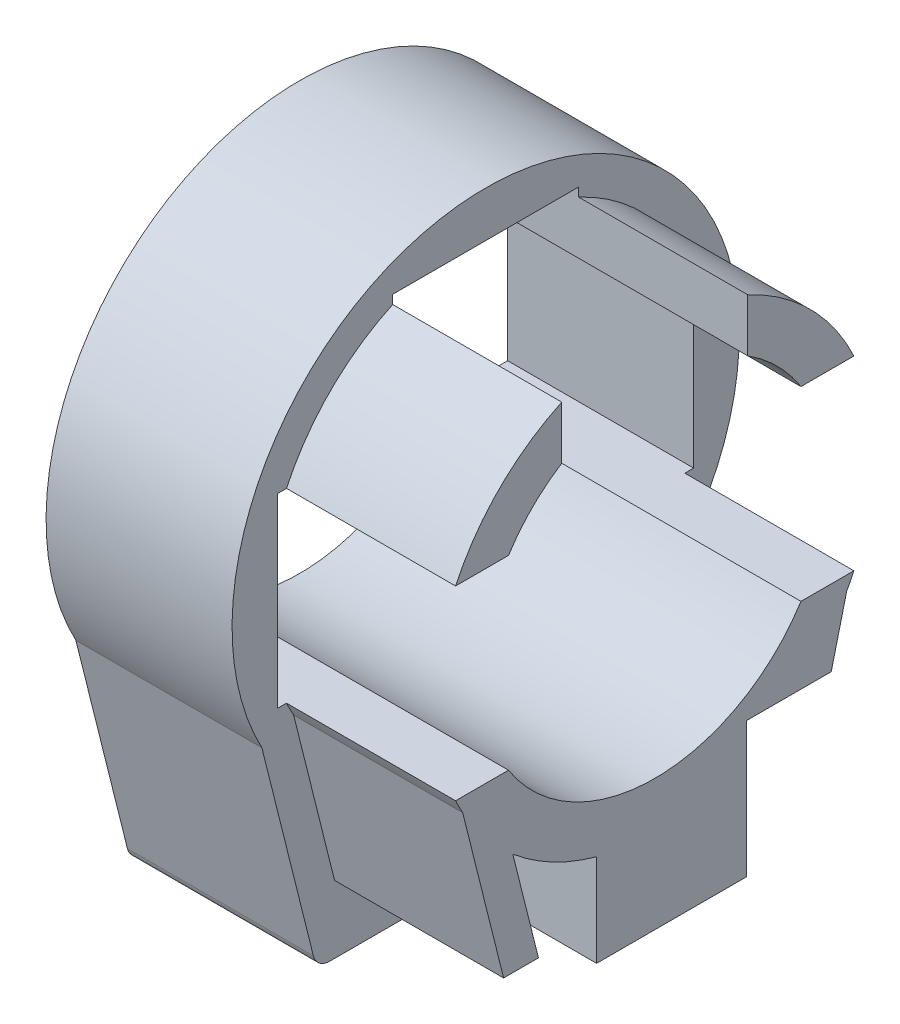
ISO-10303-21;
HEADER;
FILE_DESCRIPTION(('STEP AP214'),'2;1');
FILE_NAME('part.step','',(''),(''),'','','');
FILE_SCHEMA(('AUTOMOTIVE_DESIGN { 1 0 10303 214 1 1 1 1 }'));
ENDSEC;
DATA;
#1=APPLICATION_CONTEXT('core data for automotive mechanical design processes');
#2=APPLICATION_PROTOCOL_DEFINITION('international standard','automotive_design',2000,#1);
#3=PRODUCT_CONTEXT('',#1,'mechanical');
#4=PRODUCT('Part','Part','',(#3));
#5=PRODUCT_RELATED_PRODUCT_CATEGORY('part','',(#4));
#6=PRODUCT_DEFINITION_FORMATION('','',#4);
#7=PRODUCT_DEFINITION_CONTEXT('part definition',#1,'design');
#8=PRODUCT_DEFINITION('design','',#6,#7);
#9=PRODUCT_DEFINITION_SHAPE('','',#8);
#10=(LENGTH_UNIT() NAMED_UNIT(*) SI_UNIT(.MILLI.,.METRE.));
#11=(NAMED_UNIT(*) PLANE_ANGLE_UNIT() SI_UNIT($,.RADIAN.));
#12=(NAMED_UNIT(*) SI_UNIT($,.STERADIAN.) SOLID_ANGLE_UNIT());
#13=UNCERTAINTY_MEASURE_WITH_UNIT(LENGTH_MEASURE(1.E-05),#10,'distance_accuracy_value','');
#14=(GEOMETRIC_REPRESENTATION_CONTEXT(3) GLOBAL_UNCERTAINTY_ASSIGNED_CONTEXT((#13)) GLOBAL_UNIT_ASSIGNED_CONTEXT((#10,
#11,#12)) REPRESENTATION_CONTEXT('',''));
#15=CARTESIAN_POINT('',(0.,0.,0.));
#16=DIRECTION('',(0.,0.,1.));
#17=DIRECTION('',(1.,0.,0.));
#18=AXIS2_PLACEMENT_3D('',#15,#16,#17);
#19=CARTESIAN_POINT('',(21.001,0.,2.69999999999999));
#20=DIRECTION('',(0.,0.,1.));
#21=DIRECTION('',(1.,0.,0.));
#22=AXIS2_PLACEMENT_3D('',#19,#20,#21);
#23=PLANE('',#22);
#24=DIRECTION('',(-1.,0.,0.));
#25=VECTOR('',#24,1.);
#26=CARTESIAN_POINT('',(21.001,14.5,2.69999999999999));
#27=LINE('',#26,#25);
#28=CARTESIAN_POINT('',(11.,14.5,2.69999999999999));
#29=VERTEX_POINT('',#28);
#30=CARTESIAN_POINT('',(0.,14.5,2.69999999999999));
#31=VERTEX_POINT('',#30);
#32=EDGE_CURVE('E370',#29,#31,#27,.T.);
#33=ORIENTED_EDGE('',*,*,#32,.F.);
#34=DIRECTION('',(0.,-1.,0.));
#35=VECTOR('',#34,1.);
#36=CARTESIAN_POINT('',(11.,0.,2.69999999999999));
#37=LINE('',#36,#35);
#38=CARTESIAN_POINT('',(11.,25.5,2.69999999999999));
#39=VERTEX_POINT('',#38);
#40=EDGE_CURVE('E429',#39,#29,#37,.T.);
#41=ORIENTED_EDGE('',*,*,#40,.F.);
#42=DIRECTION('',(-1.,0.,0.));
#43=VECTOR('',#42,1.);
#44=CARTESIAN_POINT('',(21.001,25.5,2.69999999999999));
#45=LINE('',#44,#43);
#46=CARTESIAN_POINT('',(0.,25.5,2.69999999999999));
#47=VERTEX_POINT('',#46);
#48=EDGE_CURVE('E391',#39,#47,#45,.T.);
#49=ORIENTED_EDGE('',*,*,#48,.T.);
#50=DIRECTION('',(0.,1.,0.));
#51=VECTOR('',#50,1.);
#52=CARTESIAN_POINT('',(0.,0.,2.69999999999999));
#53=LINE('',#52,#51);
#54=EDGE_CURVE('E373',#31,#47,#53,.T.);
#55=ORIENTED_EDGE('',*,*,#54,.F.);
#56=EDGE_LOOP('',(#33,#41,#49,#55));
#57=FACE_BOUND('',#56,.T.);
#58=ADVANCED_FACE('F36',(#57),#23,.T.);
#59=CARTESIAN_POINT('',(21.001,32.3000000000002,3.26001851776298E-13));
#60=DIRECTION('',(0.,-1.,0.));
#61=DIRECTION('',(0.,0.,-1.));
#62=AXIS2_PLACEMENT_3D('',#59,#60,#61);
#63=PLANE('',#62);
#64=DIRECTION('',(-1.,0.,0.));
#65=VECTOR('',#64,1.);
#66=CARTESIAN_POINT('',(21.001,32.3000000000001,9.50000000000012));
#67=LINE('',#66,#65);
#68=CARTESIAN_POINT('',(11.,32.3000000000001,9.50000000000012));
#69=VERTEX_POINT('',#68);
#70=CARTESIAN_POINT('',(0.,32.3000000000001,9.50000000000012));
#71=VERTEX_POINT('',#70);
#72=EDGE_CURVE('E385',#69,#71,#67,.T.);
#73=ORIENTED_EDGE('',*,*,#72,.F.);
#74=DIRECTION('',(0.,0.,-1.));
#75=VECTOR('',#74,1.);
#76=CARTESIAN_POINT('',(11.,32.3000000000002,3.26001851776298E-13));
#77=LINE('',#76,#75);
#78=CARTESIAN_POINT('',(11.,32.3,20.5000000000001));
#79=VERTEX_POINT('',#78);
#80=EDGE_CURVE('E437',#79,#69,#77,.T.);
#81=ORIENTED_EDGE('',*,*,#80,.F.);
#82=DIRECTION('',(-1.,0.,0.));
#83=VECTOR('',#82,1.);
#84=CARTESIAN_POINT('',(21.001,32.3,20.5000000000001));
#85=LINE('',#84,#83);
#86=CARTESIAN_POINT('',(0.,32.3,20.5000000000001));
#87=VERTEX_POINT('',#86);
#88=EDGE_CURVE('E383',#79,#87,#85,.T.);
#89=ORIENTED_EDGE('',*,*,#88,.T.);
#90=DIRECTION('',(0.,0.,1.));
#91=VECTOR('',#90,1.);
#92=CARTESIAN_POINT('',(0.,32.3000000000002,3.26001851776298E-13));
#93=LINE('',#92,#91);
#94=EDGE_CURVE('E405',#71,#87,#93,.T.);
#95=ORIENTED_EDGE('',*,*,#94,.F.);
#96=EDGE_LOOP('',(#73,#81,#89,#95));
#97=FACE_BOUND('',#96,.T.);
#98=ADVANCED_FACE('F508',(#97),#63,.T.);
#99=CARTESIAN_POINT('',(21.001,-5.16632191572722E-13,27.2999999999996));
#100=DIRECTION('',(0.,0.,-1.));
#101=DIRECTION('',(0.,1.,0.));
#102=AXIS2_PLACEMENT_3D('',#99,#100,#101);
#103=PLANE('',#102);
#104=DIRECTION('',(-1.,0.,0.));
#105=VECTOR('',#104,1.);
#106=CARTESIAN_POINT('',(21.001,25.4999999999998,27.3000000000001));
#107=LINE('',#106,#105);
#108=CARTESIAN_POINT('',(11.,25.4999999999998,27.3000000000001));
#109=VERTEX_POINT('',#108);
#110=CARTESIAN_POINT('',(0.,25.4999999999998,27.3000000000001));
#111=VERTEX_POINT('',#110);
#112=EDGE_CURVE('E377',#109,#111,#107,.T.);
#113=ORIENTED_EDGE('',*,*,#112,.F.);
#114=DIRECTION('',(0.,1.,0.));
#115=VECTOR('',#114,1.);
#116=CARTESIAN_POINT('',(11.,-5.16632191572722E-13,27.2999999999996));
#117=LINE('',#116,#115);
#118=CARTESIAN_POINT('',(11.,14.4999999999998,27.2999999999999));
#119=VERTEX_POINT('',#118);
#120=EDGE_CURVE('E278',#119,#109,#117,.T.);
#121=ORIENTED_EDGE('',*,*,#120,.F.);
#122=DIRECTION('',(-1.,0.,0.));
#123=VECTOR('',#122,1.);
#124=CARTESIAN_POINT('',(21.001,14.4999999999998,27.2999999999999));
#125=LINE('',#124,#123);
#126=CARTESIAN_POINT('',(0.,14.4999999999998,27.2999999999999));
#127=VERTEX_POINT('',#126);
#128=EDGE_CURVE('E375',#119,#127,#125,.T.);
#129=ORIENTED_EDGE('',*,*,#128,.T.);
#130=DIRECTION('',(0.,-1.,0.));
#131=VECTOR('',#130,1.);
#132=CARTESIAN_POINT('',(0.,-5.16632191572722E-13,27.2999999999996));
#133=LINE('',#132,#131);
#134=EDGE_CURVE('E417',#111,#127,#133,.T.);
#135=ORIENTED_EDGE('',*,*,#134,.F.);
#136=EDGE_LOOP('',(#113,#121,#129,#135));
#137=FACE_BOUND('',#136,.T.);
#138=ADVANCED_FACE('F614',(#137),#103,.T.);
#139=CARTESIAN_POINT('',(11.,0.999999999999997,24.2192235935956));
#140=DIRECTION('',(-1.,0.,0.));
#141=DIRECTION('',(0.,0.,1.));
#142=AXIS2_PLACEMENT_3D('',#139,#140,#141);
#143=PLANE('',#142);
#144=CARTESIAN_POINT('',(11.,0.999999999999997,24.2192235935956));
#145=DIRECTION('',(1.,0.,0.));
#146=DIRECTION('',(0.,0.,1.));
#147=AXIS2_PLACEMENT_3D('',#144,#145,#146);
#148=CIRCLE('',#147,0.999999999999999);
#149=CARTESIAN_POINT('',(11.,0.757464374963668,25.1893660937409));
#150=VERTEX_POINT('',#149);
#151=CARTESIAN_POINT('',(11.,0.,24.2192235935956));
#152=VERTEX_POINT('',#151);
#153=EDGE_CURVE('E535',#150,#152,#148,.T.);
#154=ORIENTED_EDGE('',*,*,#153,.T.);
#155=DIRECTION('',(0.,0.,-1.));
#156=VECTOR('',#155,1.);
#157=CARTESIAN_POINT('',(11.,0.,5.78077640640443));
#158=LINE('',#157,#156);
#159=CARTESIAN_POINT('',(11.,0.,5.78077640640443));
#160=VERTEX_POINT('',#159);
#161=EDGE_CURVE('E538',#152,#160,#158,.T.);
#162=ORIENTED_EDGE('',*,*,#161,.T.);
#163=CARTESIAN_POINT('',(11.,0.999999999999998,5.78077640640442));
#164=DIRECTION('',(1.,0.,0.));
#165=DIRECTION('',(0.,0.,-1.));
#166=AXIS2_PLACEMENT_3D('',#163,#164,#165);
#167=CIRCLE('',#166,1.);
#168=CARTESIAN_POINT('',(11.,0.757464374963669,4.81063390625909));
#169=VERTEX_POINT('',#168);
#170=EDGE_CURVE('E541',#160,#169,#167,.T.);
#171=ORIENTED_EDGE('',*,*,#170,.T.);
#172=DIRECTION('',(0.,0.970142500145332,-0.242535625036333));
#173=VECTOR('',#172,1.);
#174=CARTESIAN_POINT('',(11.,12.9411764705883,1.76470588235294));
#175=LINE('',#174,#173);
#176=CARTESIAN_POINT('',(11.,12.9411764705883,1.76470588235294));
#177=VERTEX_POINT('',#176);
#178=EDGE_CURVE('E543',#169,#177,#175,.T.);
#179=ORIENTED_EDGE('',*,*,#178,.T.);
#180=CARTESIAN_POINT('',(11.,20.,15.));
#181=DIRECTION('',(1.,0.,0.));
#182=DIRECTION('',(0.,0.,-1.));
#183=AXIS2_PLACEMENT_3D('',#180,#181,#182);
#184=CIRCLE('',#183,15.);
#185=CARTESIAN_POINT('',(11.,12.9411764705883,28.2352941176471));
#186=VERTEX_POINT('',#185);
#187=EDGE_CURVE('E545',#177,#186,#184,.T.);
#188=ORIENTED_EDGE('',*,*,#187,.T.);
#189=DIRECTION('',(0.,-0.970142500145332,-0.242535625036334));
#190=VECTOR('',#189,1.);
#191=CARTESIAN_POINT('',(11.,12.9411764705883,28.2352941176471));
#192=LINE('',#191,#190);
#193=EDGE_CURVE('E547',#186,#150,#192,.T.);
#194=ORIENTED_EDGE('',*,*,#193,.T.);
#195=EDGE_LOOP('',(#154,#162,#171,#179,#188,#194));
#196=FACE_BOUND('',#195,.T.);
#197=ORIENTED_EDGE('',*,*,#40,.T.);
#198=DIRECTION('',(0.,0.,-1.));
#199=VECTOR('',#198,1.);
#200=CARTESIAN_POINT('',(11.,14.5,0.));
#201=LINE('',#200,#199);
#202=CARTESIAN_POINT('',(11.,14.5,3.22078101061026));
#203=VERTEX_POINT('',#202);
#204=EDGE_CURVE('E427',#203,#29,#201,.T.);
#205=ORIENTED_EDGE('',*,*,#204,.F.);
#206=CARTESIAN_POINT('',(11.,20.,15.));
#207=DIRECTION('',(1.,0.,0.));
#208=DIRECTION('',(0.,0.,-1.));
#209=AXIS2_PLACEMENT_3D('',#206,#207,#208);
#210=CIRCLE('',#209,13.);
#211=CARTESIAN_POINT('',(11.,13.6737885517657,3.64310567486741));
#212=VERTEX_POINT('',#211);
#213=EDGE_CURVE('E277',#212,#203,#210,.T.);
#214=ORIENTED_EDGE('',*,*,#213,.F.);
#215=DIRECTION('',(0.,0.970142500145332,-0.242535625036333));
#216=VECTOR('',#215,1.);
#217=CARTESIAN_POINT('',(11.,2.,6.56155281280884));
#218=LINE('',#217,#216);
#219=CARTESIAN_POINT('',(11.,10.,4.56155281280884));
#220=VERTEX_POINT('',#219);
#221=EDGE_CURVE('E490',#220,#212,#218,.T.);
#222=ORIENTED_EDGE('',*,*,#221,.F.);
#223=DIRECTION('',(0.,0.,1.));
#224=VECTOR('',#223,1.);
#225=CARTESIAN_POINT('',(11.,10.,9.56155281280883));
#226=LINE('',#225,#224);
#227=CARTESIAN_POINT('',(11.,10.,9.56155281280883));
#228=VERTEX_POINT('',#227);
#229=EDGE_CURVE('E353',#220,#228,#226,.T.);
#230=ORIENTED_EDGE('',*,*,#229,.T.);
#231=DIRECTION('',(0.,-1.,0.));
#232=VECTOR('',#231,1.);
#233=CARTESIAN_POINT('',(11.,2.,9.56155281280884));
#234=LINE('',#233,#232);
#235=CARTESIAN_POINT('',(11.,2.,9.56155281280884));
#236=VERTEX_POINT('',#235);
#237=EDGE_CURVE('E345',#228,#236,#234,.T.);
#238=ORIENTED_EDGE('',*,*,#237,.T.);
#239=DIRECTION('',(0.,0.,-1.));
#240=VECTOR('',#239,1.);
#241=CARTESIAN_POINT('',(11.,2.,23.4384471871912));
#242=LINE('',#241,#240);
#243=CARTESIAN_POINT('',(11.,2.,18.4384471871912));
#244=VERTEX_POINT('',#243);
#245=EDGE_CURVE('E494',#244,#236,#242,.T.);
#246=ORIENTED_EDGE('',*,*,#245,.F.);
#247=DIRECTION('',(0.,1.,0.));
#248=VECTOR('',#247,1.);
#249=CARTESIAN_POINT('',(11.,2.,18.4384471871912));
#250=LINE('',#249,#248);
#251=CARTESIAN_POINT('',(11.,7.46297160644129,18.4384471871912));
#252=VERTEX_POINT('',#251);
#253=EDGE_CURVE('E336',#244,#252,#250,.T.);
#254=ORIENTED_EDGE('',*,*,#253,.T.);
#255=CARTESIAN_POINT('',(11.,20.,15.));
#256=DIRECTION('',(-1.,0.,0.));
#257=DIRECTION('',(0.,0.,-1.));
#258=AXIS2_PLACEMENT_3D('',#255,#256,#257);
#259=CIRCLE('',#258,13.);
#260=CARTESIAN_POINT('',(11.,10.0745188980685,23.3955240988995));
#261=VERTEX_POINT('',#260);
#262=EDGE_CURVE('E311',#252,#261,#259,.T.);
#263=ORIENTED_EDGE('',*,*,#262,.T.);
#264=DIRECTION('',(0.,-0.970142500145333,-0.24253562503633));
#265=VECTOR('',#264,1.);
#266=CARTESIAN_POINT('',(11.,9.27078631172835,23.1945909523144));
#267=LINE('',#266,#265);
#268=CARTESIAN_POINT('',(11.,4.,21.8768943743823));
#269=VERTEX_POINT('',#268);
#270=EDGE_CURVE('E324',#261,#269,#267,.T.);
#271=ORIENTED_EDGE('',*,*,#270,.T.);
#272=DIRECTION('',(0.,0.,1.));
#273=VECTOR('',#272,1.);
#274=CARTESIAN_POINT('',(11.,4.,21.8768943743823));
#275=LINE('',#274,#273);
#276=CARTESIAN_POINT('',(11.,4.,23.9384471871912));
#277=VERTEX_POINT('',#276);
#278=EDGE_CURVE('E338',#269,#277,#275,.T.);
#279=ORIENTED_EDGE('',*,*,#278,.T.);
#280=DIRECTION('',(0.,-0.970142500145332,-0.242535625036334));
#281=VECTOR('',#280,1.);
#282=CARTESIAN_POINT('',(11.,13.6737885517657,26.3568943251326));
#283=LINE('',#282,#281);
#284=CARTESIAN_POINT('',(11.,13.6737885517657,26.3568943251326));
#285=VERTEX_POINT('',#284);
#286=EDGE_CURVE('E350',#285,#277,#283,.T.);
#287=ORIENTED_EDGE('',*,*,#286,.F.);
#288=CARTESIAN_POINT('',(11.,14.4999999999998,26.7792189893896));
#289=VERTEX_POINT('',#288);
#290=EDGE_CURVE('E486',#289,#285,#210,.T.);
#291=ORIENTED_EDGE('',*,*,#290,.F.);
#292=DIRECTION('',(0.,0.,1.));
#293=VECTOR('',#292,1.);
#294=CARTESIAN_POINT('',(11.,14.5000000000011,7.02808153399398E-13));
#295=LINE('',#294,#293);
#296=EDGE_CURVE('E59',#289,#119,#295,.T.);
#297=ORIENTED_EDGE('',*,*,#296,.T.);
#298=ORIENTED_EDGE('',*,*,#120,.T.);
#299=DIRECTION('',(0.,0.,1.));
#300=VECTOR('',#299,1.);
#301=CARTESIAN_POINT('',(11.,25.500000000001,1.16326866769547E-12));
#302=LINE('',#301,#300);
#303=CARTESIAN_POINT('',(11.,25.4999999999998,26.7792189893898));
#304=VERTEX_POINT('',#303);
#305=EDGE_CURVE('E442',#304,#109,#302,.T.);
#306=ORIENTED_EDGE('',*,*,#305,.F.);
#307=CARTESIAN_POINT('',(11.,31.7792189893897,20.5000000000001));
#308=VERTEX_POINT('',#307);
#309=EDGE_CURVE('E489',#308,#304,#210,.T.);
#310=ORIENTED_EDGE('',*,*,#309,.F.);
#311=DIRECTION('',(0.,1.,0.));
#312=VECTOR('',#311,1.);
#313=CARTESIAN_POINT('',(11.,-4.87071235452534E-13,20.4999999999993));
#314=LINE('',#313,#312);
#315=EDGE_CURVE('E439',#308,#79,#314,.T.);
#316=ORIENTED_EDGE('',*,*,#315,.T.);
#317=ORIENTED_EDGE('',*,*,#80,.T.);
#318=DIRECTION('',(0.,1.,0.));
#319=VECTOR('',#318,1.);
#320=CARTESIAN_POINT('',(11.,-2.39258894683255E-13,9.4999999999993));
#321=LINE('',#320,#319);
#322=CARTESIAN_POINT('',(11.,31.7792189893898,9.5000000000001));
#323=VERTEX_POINT('',#322);
#324=EDGE_CURVE('E434',#323,#69,#321,.T.);
#325=ORIENTED_EDGE('',*,*,#324,.F.);
#326=CARTESIAN_POINT('',(11.,25.5,3.22078101061026));
#327=VERTEX_POINT('',#326);
#328=EDGE_CURVE('E493',#327,#323,#210,.T.);
#329=ORIENTED_EDGE('',*,*,#328,.F.);
#330=DIRECTION('',(0.,0.,-1.));
#331=VECTOR('',#330,1.);
#332=CARTESIAN_POINT('',(11.,25.5,0.));
#333=LINE('',#332,#331);
#334=EDGE_CURVE('E431',#327,#39,#333,.T.);
#335=ORIENTED_EDGE('',*,*,#334,.T.);
#336=EDGE_LOOP('',(#197,#205,#214,#222,#230,#238,#246,#254,#263,#271,#279,#287,#291,#297,#298,
#306,#310,#316,#317,#325,#329,#335));
#337=FACE_BOUND('',#336,.T.);
#338=ADVANCED_FACE('F483',(#196,#337),#143,.F.);
#339=CARTESIAN_POINT('',(0.,0.999999999999997,24.2192235935956));
#340=DIRECTION('',(-1.,0.,0.));
#341=DIRECTION('',(0.,0.,1.));
#342=AXIS2_PLACEMENT_3D('',#339,#340,#341);
#343=PLANE('',#342);
#344=CARTESIAN_POINT('',(0.,0.999999999999997,24.2192235935956));
#345=DIRECTION('',(1.,0.,0.));
#346=DIRECTION('',(0.,0.,1.));
#347=AXIS2_PLACEMENT_3D('',#344,#345,#346);
#348=CIRCLE('',#347,0.999999999999999);
#349=CARTESIAN_POINT('',(0.,0.757464374963668,25.1893660937409));
#350=VERTEX_POINT('',#349);
#351=CARTESIAN_POINT('',(0.,0.,24.2192235935956));
#352=VERTEX_POINT('',#351);
#353=EDGE_CURVE('E529',#350,#352,#348,.T.);
#354=ORIENTED_EDGE('',*,*,#353,.F.);
#355=DIRECTION('',(0.,-0.970142500145332,-0.242535625036334));
#356=VECTOR('',#355,1.);
#357=CARTESIAN_POINT('',(0.,12.9411764705883,28.2352941176471));
#358=LINE('',#357,#356);
#359=CARTESIAN_POINT('',(0.,12.9411764705883,28.2352941176471));
#360=VERTEX_POINT('',#359);
#361=EDGE_CURVE('E539',#360,#350,#358,.T.);
#362=ORIENTED_EDGE('',*,*,#361,.F.);
#363=CARTESIAN_POINT('',(0.,20.,15.));
#364=DIRECTION('',(1.,0.,0.));
#365=DIRECTION('',(0.,0.,-1.));
#366=AXIS2_PLACEMENT_3D('',#363,#364,#365);
#367=CIRCLE('',#366,15.);
#368=CARTESIAN_POINT('',(0.,12.9411764705883,1.76470588235294));
#369=VERTEX_POINT('',#368);
#370=EDGE_CURVE('E555',#369,#360,#367,.T.);
#371=ORIENTED_EDGE('',*,*,#370,.F.);
#372=DIRECTION('',(0.,0.970142500145332,-0.242535625036333));
#373=VECTOR('',#372,1.);
#374=CARTESIAN_POINT('',(0.,12.9411764705883,1.76470588235294));
#375=LINE('',#374,#373);
#376=CARTESIAN_POINT('',(0.,0.757464374963669,4.81063390625909));
#377=VERTEX_POINT('',#376);
#378=EDGE_CURVE('E553',#377,#369,#375,.T.);
#379=ORIENTED_EDGE('',*,*,#378,.F.);
#380=CARTESIAN_POINT('',(0.,0.999999999999998,5.78077640640442));
#381=DIRECTION('',(1.,0.,0.));
#382=DIRECTION('',(0.,0.,-1.));
#383=AXIS2_PLACEMENT_3D('',#380,#381,#382);
#384=CIRCLE('',#383,1.);
#385=CARTESIAN_POINT('',(0.,0.,5.78077640640443));
#386=VERTEX_POINT('',#385);
#387=EDGE_CURVE('E551',#386,#377,#384,.T.);
#388=ORIENTED_EDGE('',*,*,#387,.F.);
#389=DIRECTION('',(0.,0.,-1.));
#390=VECTOR('',#389,1.);
#391=CARTESIAN_POINT('',(0.,0.,5.78077640640443));
#392=LINE('',#391,#390);
#393=EDGE_CURVE('E532',#352,#386,#392,.T.);
#394=ORIENTED_EDGE('',*,*,#393,.F.);
#395=EDGE_LOOP('',(#354,#362,#371,#379,#388,#394));
#396=FACE_BOUND('',#395,.T.);
#397=ORIENTED_EDGE('',*,*,#54,.T.);
#398=DIRECTION('',(0.,0.,1.));
#399=VECTOR('',#398,1.);
#400=CARTESIAN_POINT('',(0.,25.5,0.));
#401=LINE('',#400,#399);
#402=CARTESIAN_POINT('',(0.,25.5,6.35057805399691));
#403=VERTEX_POINT('',#402);
#404=EDGE_CURVE('E396',#47,#403,#401,.T.);
#405=ORIENTED_EDGE('',*,*,#404,.T.);
#406=CARTESIAN_POINT('',(0.,20.,15.));
#407=DIRECTION('',(-1.,0.,0.));
#408=DIRECTION('',(0.,0.,1.));
#409=AXIS2_PLACEMENT_3D('',#406,#407,#408);
#410=CIRCLE('',#409,10.25);
#411=CARTESIAN_POINT('',(0.,28.6494219460031,9.50000000000002));
#412=VERTEX_POINT('',#411);
#413=EDGE_CURVE('E399',#412,#403,#410,.T.);
#414=ORIENTED_EDGE('',*,*,#413,.F.);
#415=DIRECTION('',(0.,-1.,0.));
#416=VECTOR('',#415,1.);
#417=CARTESIAN_POINT('',(0.,-2.39258894683255E-13,9.4999999999993));
#418=LINE('',#417,#416);
#419=EDGE_CURVE('E402',#71,#412,#418,.T.);
#420=ORIENTED_EDGE('',*,*,#419,.F.);
#421=ORIENTED_EDGE('',*,*,#94,.T.);
#422=DIRECTION('',(0.,-1.,0.));
#423=VECTOR('',#422,1.);
#424=CARTESIAN_POINT('',(0.,-4.87071235452534E-13,20.4999999999993));
#425=LINE('',#424,#423);
#426=CARTESIAN_POINT('',(0.,28.6494219460031,20.5));
#427=VERTEX_POINT('',#426);
#428=EDGE_CURVE('E408',#87,#427,#425,.T.);
#429=ORIENTED_EDGE('',*,*,#428,.T.);
#430=CARTESIAN_POINT('',(0.,20.,15.));
#431=DIRECTION('',(-1.,0.,0.));
#432=DIRECTION('',(0.,0.,1.));
#433=AXIS2_PLACEMENT_3D('',#430,#431,#432);
#434=CIRCLE('',#433,10.25);
#435=CARTESIAN_POINT('',(0.,25.4999999999999,23.6494219460031));
#436=VERTEX_POINT('',#435);
#437=EDGE_CURVE('E411',#436,#427,#434,.T.);
#438=ORIENTED_EDGE('',*,*,#437,.F.);
#439=DIRECTION('',(0.,0.,-1.));
#440=VECTOR('',#439,1.);
#441=CARTESIAN_POINT('',(0.,25.500000000001,1.16326866769547E-12));
#442=LINE('',#441,#440);
#443=EDGE_CURVE('E414',#111,#436,#442,.T.);
#444=ORIENTED_EDGE('',*,*,#443,.F.);
#445=ORIENTED_EDGE('',*,*,#134,.T.);
#446=DIRECTION('',(0.,0.,-1.));
#447=VECTOR('',#446,1.);
#448=CARTESIAN_POINT('',(0.,14.5000000000011,7.02808153399398E-13));
#449=LINE('',#448,#447);
#450=CARTESIAN_POINT('',(0.,14.4999999999999,23.6494219460031));
#451=VERTEX_POINT('',#450);
#452=EDGE_CURVE('E420',#127,#451,#449,.T.);
#453=ORIENTED_EDGE('',*,*,#452,.T.);
#454=CARTESIAN_POINT('',(0.,20.,15.));
#455=DIRECTION('',(-1.,0.,0.));
#456=DIRECTION('',(0.,0.,1.));
#457=AXIS2_PLACEMENT_3D('',#454,#455,#456);
#458=CIRCLE('',#457,10.25);
#459=CARTESIAN_POINT('',(0.,14.5,6.35057805399691));
#460=VERTEX_POINT('',#459);
#461=EDGE_CURVE('E423',#460,#451,#458,.T.);
#462=ORIENTED_EDGE('',*,*,#461,.F.);
#463=DIRECTION('',(0.,0.,1.));
#464=VECTOR('',#463,1.);
#465=CARTESIAN_POINT('',(0.,14.5,0.));
#466=LINE('',#465,#464);
#467=EDGE_CURVE('E51',#31,#460,#466,.T.);
#468=ORIENTED_EDGE('',*,*,#467,.F.);
#469=EDGE_LOOP('',(#397,#405,#414,#420,#421,#429,#438,#444,#445,#453,#462,#468));
#470=FACE_BOUND('',#469,.T.);
#471=ADVANCED_FACE('F477',(#396,#470),#343,.T.);
#472=CARTESIAN_POINT('',(21.,20.,15.));
#473=DIRECTION('',(1.,0.,0.));
#474=DIRECTION('',(0.,0.,-1.));
#475=AXIS2_PLACEMENT_3D('',#472,#473,#474);
#476=PLANE('',#475);
#477=CARTESIAN_POINT('',(21.,20.,15.));
#478=DIRECTION('',(1.,0.,0.));
#479=DIRECTION('',(0.,0.,-1.));
#480=AXIS2_PLACEMENT_3D('',#477,#478,#479);
#481=CIRCLE('',#480,10.25);
#482=CARTESIAN_POINT('',(21.,28.6494219460031,9.50000000000002));
#483=VERTEX_POINT('',#482);
#484=CARTESIAN_POINT('',(21.,25.5,6.3505780539969));
#485=VERTEX_POINT('',#484);
#486=EDGE_CURVE('E457',#483,#485,#481,.F.);
#487=ORIENTED_EDGE('',*,*,#486,.T.);
#488=DIRECTION('',(0.,0.,1.));
#489=VECTOR('',#488,1.);
#490=CARTESIAN_POINT('',(21.,25.5,0.));
#491=LINE('',#490,#489);
#492=CARTESIAN_POINT('',(21.,25.5,3.22078101061026));
#493=VERTEX_POINT('',#492);
#494=EDGE_CURVE('E455',#493,#485,#491,.T.);
#495=ORIENTED_EDGE('',*,*,#494,.F.);
#496=CARTESIAN_POINT('',(21.,20.,15.));
#497=DIRECTION('',(1.,0.,0.));
#498=DIRECTION('',(0.,0.,-1.));
#499=AXIS2_PLACEMENT_3D('',#496,#497,#498);
#500=CIRCLE('',#499,13.);
#501=CARTESIAN_POINT('',(21.,31.7792189893898,9.5000000000001));
#502=VERTEX_POINT('',#501);
#503=EDGE_CURVE('E287',#493,#502,#500,.T.);
#504=ORIENTED_EDGE('',*,*,#503,.T.);
#505=DIRECTION('',(0.,-1.,0.));
#506=VECTOR('',#505,1.);
#507=CARTESIAN_POINT('',(21.,-2.39258894683255E-13,9.4999999999993));
#508=LINE('',#507,#506);
#509=EDGE_CURVE('E460',#502,#483,#508,.T.);
#510=ORIENTED_EDGE('',*,*,#509,.T.);
#511=EDGE_LOOP('',(#487,#495,#504,#510));
#512=FACE_BOUND('',#511,.T.);
#513=ADVANCED_FACE('F516',(#512),#476,.T.);
#514=CARTESIAN_POINT('',(21.,20.,15.));
#515=DIRECTION('',(1.,0.,0.));
#516=DIRECTION('',(0.,0.,-1.));
#517=AXIS2_PLACEMENT_3D('',#514,#515,#516);
#518=CIRCLE('',#517,10.25);
#519=CARTESIAN_POINT('',(21.,25.4999999999999,23.6494219460031));
#520=VERTEX_POINT('',#519);
#521=CARTESIAN_POINT('',(21.,28.6494219460031,20.5));
#522=VERTEX_POINT('',#521);
#523=EDGE_CURVE('E465',#520,#522,#518,.F.);
#524=ORIENTED_EDGE('',*,*,#523,.T.);
#525=DIRECTION('',(0.,-1.,0.));
#526=VECTOR('',#525,1.);
#527=CARTESIAN_POINT('',(21.,-4.87071235452534E-13,20.4999999999993));
#528=LINE('',#527,#526);
#529=CARTESIAN_POINT('',(21.,31.7792189893897,20.5000000000001));
#530=VERTEX_POINT('',#529);
#531=EDGE_CURVE('E463',#530,#522,#528,.T.);
#532=ORIENTED_EDGE('',*,*,#531,.F.);
#533=CARTESIAN_POINT('',(21.,25.4999999999998,26.7792189893898));
#534=VERTEX_POINT('',#533);
#535=EDGE_CURVE('E294',#530,#534,#500,.T.);
#536=ORIENTED_EDGE('',*,*,#535,.T.);
#537=DIRECTION('',(0.,0.,-1.));
#538=VECTOR('',#537,1.);
#539=CARTESIAN_POINT('',(21.,25.500000000001,1.16326866769547E-12));
#540=LINE('',#539,#538);
#541=EDGE_CURVE('E267',#534,#520,#540,.T.);
#542=ORIENTED_EDGE('',*,*,#541,.T.);
#543=EDGE_LOOP('',(#524,#532,#536,#542));
#544=FACE_BOUND('',#543,.T.);
#545=ADVANCED_FACE('F606',(#544),#476,.T.);
#546=CARTESIAN_POINT('',(21.,20.,15.));
#547=DIRECTION('',(-1.,0.,0.));
#548=DIRECTION('',(0.,0.,1.));
#549=AXIS2_PLACEMENT_3D('',#546,#547,#548);
#550=CYLINDRICAL_SURFACE('',#549,13.);
#551=DIRECTION('',(-1.,0.,0.));
#552=VECTOR('',#551,1.);
#553=CARTESIAN_POINT('',(21.,25.5,3.22078101061026));
#554=LINE('',#553,#552);
#555=EDGE_CURVE('E279',#493,#327,#554,.T.);
#556=ORIENTED_EDGE('',*,*,#555,.T.);
#557=ORIENTED_EDGE('',*,*,#328,.T.);
#558=DIRECTION('',(-1.,0.,0.));
#559=VECTOR('',#558,1.);
#560=CARTESIAN_POINT('',(21.,31.7792189893898,9.5000000000001));
#561=LINE('',#560,#559);
#562=EDGE_CURVE('E448',#502,#323,#561,.T.);
#563=ORIENTED_EDGE('',*,*,#562,.F.);
#564=ORIENTED_EDGE('',*,*,#503,.F.);
#565=EDGE_LOOP('',(#556,#557,#563,#564));
#566=FACE_BOUND('',#565,.T.);
#567=ADVANCED_FACE('F500',(#566),#550,.T.);
#568=DIRECTION('',(-1.,0.,0.));
#569=VECTOR('',#568,1.);
#570=CARTESIAN_POINT('',(21.,31.7792189893897,20.5000000000001));
#571=LINE('',#570,#569);
#572=EDGE_CURVE('E450',#530,#308,#571,.T.);
#573=ORIENTED_EDGE('',*,*,#572,.T.);
#574=ORIENTED_EDGE('',*,*,#309,.T.);
#575=DIRECTION('',(-1.,0.,0.));
#576=VECTOR('',#575,1.);
#577=CARTESIAN_POINT('',(21.,25.4999999999998,26.7792189893898));
#578=LINE('',#577,#576);
#579=EDGE_CURVE('E453',#534,#304,#578,.T.);
#580=ORIENTED_EDGE('',*,*,#579,.F.);
#581=ORIENTED_EDGE('',*,*,#535,.F.);
#582=EDGE_LOOP('',(#573,#574,#580,#581));
#583=FACE_BOUND('',#582,.T.);
#584=ADVANCED_FACE('F700',(#583),#550,.T.);
#585=DIRECTION('',(-1.,0.,0.));
#586=VECTOR('',#585,1.);
#587=CARTESIAN_POINT('',(21.,14.4999999999998,26.7792189893896));
#588=LINE('',#587,#586);
#589=CARTESIAN_POINT('',(21.,14.4999999999998,26.7792189893896));
#590=VERTEX_POINT('',#589);
#591=EDGE_CURVE('E366',#590,#289,#588,.T.);
#592=ORIENTED_EDGE('',*,*,#591,.T.);
#593=ORIENTED_EDGE('',*,*,#290,.T.);
#594=DIRECTION('',(-1.,0.,0.));
#595=VECTOR('',#594,1.);
#596=CARTESIAN_POINT('',(21.,13.6737885517657,26.3568943251326));
#597=LINE('',#596,#595);
#598=CARTESIAN_POINT('',(21.,13.6737885517657,26.3568943251326));
#599=VERTEX_POINT('',#598);
#600=EDGE_CURVE('E286',#599,#285,#597,.T.);
#601=ORIENTED_EDGE('',*,*,#600,.F.);
#602=EDGE_CURVE('E289',#590,#599,#500,.T.);
#603=ORIENTED_EDGE('',*,*,#602,.F.);
#604=EDGE_LOOP('',(#592,#593,#601,#603));
#605=FACE_BOUND('',#604,.T.);
#606=ADVANCED_FACE('F678',(#605),#550,.T.);
#607=CARTESIAN_POINT('',(11.,0.999999999999997,24.2192235935956));
#608=DIRECTION('',(-1.,0.,0.));
#609=DIRECTION('',(0.,0.,1.));
#610=AXIS2_PLACEMENT_3D('',#607,#608,#609);
#611=CYLINDRICAL_SURFACE('',#610,0.999999999999999);
#612=ORIENTED_EDGE('',*,*,#353,.T.);
#613=DIRECTION('',(-1.,0.,0.));
#614=VECTOR('',#613,1.);
#615=CARTESIAN_POINT('',(11.,0.,24.2192235935956));
#616=LINE('',#615,#614);
#617=EDGE_CURVE('E11',#152,#352,#616,.T.);
#618=ORIENTED_EDGE('',*,*,#617,.F.);
#619=ORIENTED_EDGE('',*,*,#153,.F.);
#620=DIRECTION('',(-1.,0.,0.));
#621=VECTOR('',#620,1.);
#622=CARTESIAN_POINT('',(11.,0.757464374963668,25.1893660937409));
#623=LINE('',#622,#621);
#624=EDGE_CURVE('E548',#150,#350,#623,.T.);
#625=ORIENTED_EDGE('',*,*,#624,.T.);
#626=EDGE_LOOP('',(#612,#618,#619,#625));
#627=FACE_BOUND('',#626,.T.);
#628=ADVANCED_FACE('F38',(#627),#611,.T.);
#629=CARTESIAN_POINT('',(11.,0.,5.78077640640443));
#630=DIRECTION('',(0.,1.,0.));
#631=DIRECTION('',(0.,0.,1.));
#632=AXIS2_PLACEMENT_3D('',#629,#630,#631);
#633=PLANE('',#632);
#634=ORIENTED_EDGE('',*,*,#393,.T.);
#635=DIRECTION('',(-1.,0.,0.));
#636=VECTOR('',#635,1.);
#637=CARTESIAN_POINT('',(11.,0.,5.78077640640443));
#638=LINE('',#637,#636);
#639=EDGE_CURVE('E44',#160,#386,#638,.T.);
#640=ORIENTED_EDGE('',*,*,#639,.F.);
#641=ORIENTED_EDGE('',*,*,#161,.F.);
#642=ORIENTED_EDGE('',*,*,#617,.T.);
#643=EDGE_LOOP('',(#634,#640,#641,#642));
#644=FACE_BOUND('',#643,.T.);
#645=ADVANCED_FACE('F594',(#644),#633,.F.);
#646=CARTESIAN_POINT('',(11.,0.999999999999998,5.78077640640442));
#647=DIRECTION('',(-1.,0.,0.));
#648=DIRECTION('',(0.,0.,1.));
#649=AXIS2_PLACEMENT_3D('',#646,#647,#648);
#650=CYLINDRICAL_SURFACE('',#649,1.);
#651=ORIENTED_EDGE('',*,*,#387,.T.);
#652=DIRECTION('',(-1.,0.,0.));
#653=VECTOR('',#652,1.);
#654=CARTESIAN_POINT('',(11.,0.757464374963669,4.81063390625909));
#655=LINE('',#654,#653);
#656=EDGE_CURVE('E566',#169,#377,#655,.T.);
#657=ORIENTED_EDGE('',*,*,#656,.F.);
#658=ORIENTED_EDGE('',*,*,#170,.F.);
#659=ORIENTED_EDGE('',*,*,#639,.T.);
#660=EDGE_LOOP('',(#651,#657,#658,#659));
#661=FACE_BOUND('',#660,.T.);
#662=ADVANCED_FACE('F573',(#661),#650,.T.);
#663=CARTESIAN_POINT('',(11.,12.9411764705883,1.76470588235294));
#664=DIRECTION('',(0.,0.242535625036333,0.970142500145332));
#665=DIRECTION('',(0.,-0.970142500145332,0.242535625036333));
#666=AXIS2_PLACEMENT_3D('',#663,#664,#665);
#667=PLANE('',#666);
#668=ORIENTED_EDGE('',*,*,#378,.T.);
#669=DIRECTION('',(-1.,0.,0.));
#670=VECTOR('',#669,1.);
#671=CARTESIAN_POINT('',(11.,12.9411764705883,1.76470588235294));
#672=LINE('',#671,#670);
#673=EDGE_CURVE('E563',#177,#369,#672,.T.);
#674=ORIENTED_EDGE('',*,*,#673,.F.);
#675=ORIENTED_EDGE('',*,*,#178,.F.);
#676=ORIENTED_EDGE('',*,*,#656,.T.);
#677=EDGE_LOOP('',(#668,#674,#675,#676));
#678=FACE_BOUND('',#677,.T.);
#679=ADVANCED_FACE('F583',(#678),#667,.F.);
#680=CARTESIAN_POINT('',(11.,20.,15.));
#681=DIRECTION('',(-1.,0.,0.));
#682=DIRECTION('',(0.,0.,1.));
#683=AXIS2_PLACEMENT_3D('',#680,#681,#682);
#684=CYLINDRICAL_SURFACE('',#683,15.);
#685=ORIENTED_EDGE('',*,*,#370,.T.);
#686=DIRECTION('',(-1.,0.,0.));
#687=VECTOR('',#686,1.);
#688=CARTESIAN_POINT('',(11.,12.9411764705883,28.2352941176471));
#689=LINE('',#688,#687);
#690=EDGE_CURVE('E560',#186,#360,#689,.T.);
#691=ORIENTED_EDGE('',*,*,#690,.F.);
#692=ORIENTED_EDGE('',*,*,#187,.F.);
#693=ORIENTED_EDGE('',*,*,#673,.T.);
#694=EDGE_LOOP('',(#685,#691,#692,#693));
#695=FACE_BOUND('',#694,.T.);
#696=ADVANCED_FACE('F587',(#695),#684,.T.);
#697=CARTESIAN_POINT('',(11.,12.9411764705883,28.2352941176471));
#698=DIRECTION('',(0.,0.242535625036334,-0.970142500145332));
#699=DIRECTION('',(0.,0.970142500145332,0.242535625036334));
#700=AXIS2_PLACEMENT_3D('',#697,#698,#699);
#701=PLANE('',#700);
#702=ORIENTED_EDGE('',*,*,#361,.T.);
#703=ORIENTED_EDGE('',*,*,#624,.F.);
#704=ORIENTED_EDGE('',*,*,#193,.F.);
#705=ORIENTED_EDGE('',*,*,#690,.T.);
#706=EDGE_LOOP('',(#702,#703,#704,#705));
#707=FACE_BOUND('',#706,.T.);
#708=ADVANCED_FACE('F597',(#707),#701,.F.);
#709=DIRECTION('',(0.,0.,1.));
#710=VECTOR('',#709,1.);
#711=CARTESIAN_POINT('',(21.,14.5,0.));
#712=LINE('',#711,#710);
#713=CARTESIAN_POINT('',(21.,14.5,3.22078101061026));
#714=VERTEX_POINT('',#713);
#715=CARTESIAN_POINT('',(21.,14.5,6.35057805399691));
#716=VERTEX_POINT('',#715);
#717=EDGE_CURVE('E257',#714,#716,#712,.T.);
#718=ORIENTED_EDGE('',*,*,#717,.T.);
#719=CARTESIAN_POINT('',(21.,20.,15.));
#720=DIRECTION('',(1.,0.,0.));
#721=DIRECTION('',(0.,0.,-1.));
#722=AXIS2_PLACEMENT_3D('',#719,#720,#721);
#723=CIRCLE('',#722,10.25);
#724=CARTESIAN_POINT('',(21.,14.4999999999999,23.6494219460031));
#725=VERTEX_POINT('',#724);
#726=EDGE_CURVE('E368',#716,#725,#723,.F.);
#727=ORIENTED_EDGE('',*,*,#726,.T.);
#728=DIRECTION('',(0.,0.,-1.));
#729=VECTOR('',#728,1.);
#730=CARTESIAN_POINT('',(21.,14.5000000000011,7.02808153399398E-13));
#731=LINE('',#730,#729);
#732=EDGE_CURVE('E268',#590,#725,#731,.T.);
#733=ORIENTED_EDGE('',*,*,#732,.F.);
#734=ORIENTED_EDGE('',*,*,#602,.T.);
#735=DIRECTION('',(0.,-0.970142500145332,-0.242535625036334));
#736=VECTOR('',#735,1.);
#737=CARTESIAN_POINT('',(21.,13.6737885517657,26.3568943251326));
#738=LINE('',#737,#736);
#739=CARTESIAN_POINT('',(21.,4.,23.9384471871912));
#740=VERTEX_POINT('',#739);
#741=EDGE_CURVE('E304',#599,#740,#738,.T.);
#742=ORIENTED_EDGE('',*,*,#741,.T.);
#743=DIRECTION('',(0.,0.,1.));
#744=VECTOR('',#743,1.);
#745=CARTESIAN_POINT('',(21.,4.,21.8768943743823));
#746=LINE('',#745,#744);
#747=CARTESIAN_POINT('',(21.,4.,21.8768943743823));
#748=VERTEX_POINT('',#747);
#749=EDGE_CURVE('E328',#748,#740,#746,.T.);
#750=ORIENTED_EDGE('',*,*,#749,.F.);
#751=DIRECTION('',(0.,-0.970142500145332,-0.242535625036333));
#752=VECTOR('',#751,1.);
#753=CARTESIAN_POINT('',(21.,9.27078631172835,23.1945909523144));
#754=LINE('',#753,#752);
#755=CARTESIAN_POINT('',(21.,10.0745188980685,23.3955240988995));
#756=VERTEX_POINT('',#755);
#757=EDGE_CURVE('E330',#756,#748,#754,.T.);
#758=ORIENTED_EDGE('',*,*,#757,.F.);
#759=CARTESIAN_POINT('',(21.,20.,15.));
#760=DIRECTION('',(-1.,0.,0.));
#761=DIRECTION('',(0.,0.,-1.));
#762=AXIS2_PLACEMENT_3D('',#759,#760,#761);
#763=CIRCLE('',#762,13.);
#764=CARTESIAN_POINT('',(21.,7.46297160644129,18.4384471871912));
#765=VERTEX_POINT('',#764);
#766=EDGE_CURVE('E321',#765,#756,#763,.T.);
#767=ORIENTED_EDGE('',*,*,#766,.F.);
#768=DIRECTION('',(0.,1.,0.));
#769=VECTOR('',#768,1.);
#770=CARTESIAN_POINT('',(21.,6.94522765648909,18.4384471871912));
#771=LINE('',#770,#769);
#772=CARTESIAN_POINT('',(21.,2.,18.4384471871912));
#773=VERTEX_POINT('',#772);
#774=EDGE_CURVE('E325',#773,#765,#771,.T.);
#775=ORIENTED_EDGE('',*,*,#774,.F.);
#776=DIRECTION('',(0.,0.,-1.));
#777=VECTOR('',#776,1.);
#778=CARTESIAN_POINT('',(21.,2.,23.4384471871912));
#779=LINE('',#778,#777);
#780=CARTESIAN_POINT('',(21.,2.,9.56155281280884));
#781=VERTEX_POINT('',#780);
#782=EDGE_CURVE('E302',#773,#781,#779,.T.);
#783=ORIENTED_EDGE('',*,*,#782,.T.);
#784=DIRECTION('',(0.,-1.,0.));
#785=VECTOR('',#784,1.);
#786=CARTESIAN_POINT('',(21.,2.,9.56155281280884));
#787=LINE('',#786,#785);
#788=CARTESIAN_POINT('',(21.,10.,9.56155281280883));
#789=VERTEX_POINT('',#788);
#790=EDGE_CURVE('E351',#789,#781,#787,.T.);
#791=ORIENTED_EDGE('',*,*,#790,.F.);
#792=DIRECTION('',(0.,0.,1.));
#793=VECTOR('',#792,1.);
#794=CARTESIAN_POINT('',(21.,10.,9.56155281280883));
#795=LINE('',#794,#793);
#796=CARTESIAN_POINT('',(21.,10.,4.56155281280884));
#797=VERTEX_POINT('',#796);
#798=EDGE_CURVE('E320',#797,#789,#795,.T.);
#799=ORIENTED_EDGE('',*,*,#798,.F.);
#800=DIRECTION('',(0.,0.970142500145332,-0.242535625036333));
#801=VECTOR('',#800,1.);
#802=CARTESIAN_POINT('',(21.,2.,6.56155281280884));
#803=LINE('',#802,#801);
#804=CARTESIAN_POINT('',(21.,13.6737885517657,3.64310567486741));
#805=VERTEX_POINT('',#804);
#806=EDGE_CURVE('E284',#797,#805,#803,.T.);
#807=ORIENTED_EDGE('',*,*,#806,.T.);
#808=EDGE_CURVE('E275',#805,#714,#500,.T.);
#809=ORIENTED_EDGE('',*,*,#808,.T.);
#810=EDGE_LOOP('',(#718,#727,#733,#734,#742,#750,#758,#767,#775,#783,#791,#799,#807,#809));
#811=FACE_BOUND('',#810,.T.);
#812=ADVANCED_FACE('F281',(#811),#476,.T.);
#813=CARTESIAN_POINT('',(21.,13.6737885517657,26.3568943251326));
#814=DIRECTION('',(0.,0.242535625036334,-0.970142500145332));
#815=DIRECTION('',(0.,0.970142500145332,0.242535625036334));
#816=AXIS2_PLACEMENT_3D('',#813,#814,#815);
#817=PLANE('',#816);
#818=ORIENTED_EDGE('',*,*,#286,.T.);
#819=DIRECTION('',(1.,0.,0.));
#820=VECTOR('',#819,1.);
#821=CARTESIAN_POINT('',(11.,4.,23.9384471871912));
#822=LINE('',#821,#820);
#823=EDGE_CURVE('E310',#277,#740,#822,.T.);
#824=ORIENTED_EDGE('',*,*,#823,.T.);
#825=ORIENTED_EDGE('',*,*,#741,.F.);
#826=ORIENTED_EDGE('',*,*,#600,.T.);
#827=EDGE_LOOP('',(#818,#824,#825,#826));
#828=FACE_BOUND('',#827,.T.);
#829=ADVANCED_FACE('F604',(#828),#817,.F.);
#830=CARTESIAN_POINT('',(21.,2.,23.4384471871912));
#831=DIRECTION('',(0.,1.,0.));
#832=DIRECTION('',(0.,0.,1.));
#833=AXIS2_PLACEMENT_3D('',#830,#831,#832);
#834=PLANE('',#833);
#835=CARTESIAN_POINT('',(16.,2.,14.));
#836=DIRECTION('',(0.,-1.,0.));
#837=DIRECTION('',(0.,0.,-1.));
#838=AXIS2_PLACEMENT_3D('',#835,#836,#837);
#839=CIRCLE('',#838,1.55);
#840=CARTESIAN_POINT('',(16.,2.,12.45));
#841=VERTEX_POINT('',#840);
#842=EDGE_CURVE('E360',#841,#841,#839,.T.);
#843=ORIENTED_EDGE('',*,*,#842,.F.);
#844=EDGE_LOOP('',(#843));
#845=FACE_BOUND('',#844,.T.);
#846=ORIENTED_EDGE('',*,*,#245,.T.);
#847=DIRECTION('',(1.,0.,0.));
#848=VECTOR('',#847,1.);
#849=CARTESIAN_POINT('',(11.,2.,9.56155281280884));
#850=LINE('',#849,#848);
#851=EDGE_CURVE('E347',#236,#781,#850,.T.);
#852=ORIENTED_EDGE('',*,*,#851,.T.);
#853=ORIENTED_EDGE('',*,*,#782,.F.);
#854=DIRECTION('',(1.,0.,0.));
#855=VECTOR('',#854,1.);
#856=CARTESIAN_POINT('',(11.,2.,18.4384471871912));
#857=LINE('',#856,#855);
#858=EDGE_CURVE('E314',#244,#773,#857,.T.);
#859=ORIENTED_EDGE('',*,*,#858,.F.);
#860=EDGE_LOOP('',(#846,#852,#853,#859));
#861=FACE_BOUND('',#860,.T.);
#862=ADVANCED_FACE('F681',(#845,#861),#834,.F.);
#863=CARTESIAN_POINT('',(21.,2.,6.56155281280884));
#864=DIRECTION('',(0.,0.242535625036333,0.970142500145332));
#865=DIRECTION('',(0.,-0.970142500145332,0.242535625036333));
#866=AXIS2_PLACEMENT_3D('',#863,#864,#865);
#867=PLANE('',#866);
#868=ORIENTED_EDGE('',*,*,#806,.F.);
#869=DIRECTION('',(1.,0.,0.));
#870=VECTOR('',#869,1.);
#871=CARTESIAN_POINT('',(11.,10.,4.56155281280884));
#872=LINE('',#871,#870);
#873=EDGE_CURVE('E342',#220,#797,#872,.T.);
#874=ORIENTED_EDGE('',*,*,#873,.F.);
#875=ORIENTED_EDGE('',*,*,#221,.T.);
#876=DIRECTION('',(-1.,0.,0.));
#877=VECTOR('',#876,1.);
#878=CARTESIAN_POINT('',(21.,13.6737885517657,3.64310567486741));
#879=LINE('',#878,#877);
#880=EDGE_CURVE('E291',#805,#212,#879,.T.);
#881=ORIENTED_EDGE('',*,*,#880,.F.);
#882=EDGE_LOOP('',(#868,#874,#875,#881));
#883=FACE_BOUND('',#882,.T.);
#884=ADVANCED_FACE('F677',(#883),#867,.F.);
#885=ORIENTED_EDGE('',*,*,#213,.T.);
#886=DIRECTION('',(-1.,0.,0.));
#887=VECTOR('',#886,1.);
#888=CARTESIAN_POINT('',(21.,14.5,3.22078101061026));
#889=LINE('',#888,#887);
#890=EDGE_CURVE('E261',#714,#203,#889,.T.);
#891=ORIENTED_EDGE('',*,*,#890,.F.);
#892=ORIENTED_EDGE('',*,*,#808,.F.);
#893=ORIENTED_EDGE('',*,*,#880,.T.);
#894=EDGE_LOOP('',(#885,#891,#892,#893));
#895=FACE_BOUND('',#894,.T.);
#896=ADVANCED_FACE('F273',(#895),#550,.T.);
#897=CARTESIAN_POINT('',(11.,2.,9.56155281280884));
#898=DIRECTION('',(0.,0.,1.));
#899=DIRECTION('',(0.,-1.,0.));
#900=AXIS2_PLACEMENT_3D('',#897,#898,#899);
#901=PLANE('',#900);
#902=ORIENTED_EDGE('',*,*,#790,.T.);
#903=ORIENTED_EDGE('',*,*,#851,.F.);
#904=ORIENTED_EDGE('',*,*,#237,.F.);
#905=DIRECTION('',(1.,0.,0.));
#906=VECTOR('',#905,1.);
#907=CARTESIAN_POINT('',(11.,10.,9.56155281280883));
#908=LINE('',#907,#906);
#909=EDGE_CURVE('E344',#228,#789,#908,.T.);
#910=ORIENTED_EDGE('',*,*,#909,.T.);
#911=EDGE_LOOP('',(#902,#903,#904,#910));
#912=FACE_BOUND('',#911,.T.);
#913=ADVANCED_FACE('F652',(#912),#901,.F.);
#914=CARTESIAN_POINT('',(11.,10.,9.56155281280883));
#915=DIRECTION('',(0.,1.,0.));
#916=DIRECTION('',(0.,0.,1.));
#917=AXIS2_PLACEMENT_3D('',#914,#915,#916);
#918=PLANE('',#917);
#919=ORIENTED_EDGE('',*,*,#798,.T.);
#920=ORIENTED_EDGE('',*,*,#909,.F.);
#921=ORIENTED_EDGE('',*,*,#229,.F.);
#922=ORIENTED_EDGE('',*,*,#873,.T.);
#923=EDGE_LOOP('',(#919,#920,#921,#922));
#924=FACE_BOUND('',#923,.T.);
#925=ADVANCED_FACE('F655',(#924),#918,.F.);
#926=CARTESIAN_POINT('',(11.,20.,15.));
#927=DIRECTION('',(1.,0.,0.));
#928=DIRECTION('',(0.,0.,-1.));
#929=AXIS2_PLACEMENT_3D('',#926,#927,#928);
#930=CYLINDRICAL_SURFACE('',#929,13.);
#931=ORIENTED_EDGE('',*,*,#766,.T.);
#932=DIRECTION('',(1.,0.,0.));
#933=VECTOR('',#932,1.);
#934=CARTESIAN_POINT('',(11.,10.0745188980685,23.3955240988995));
#935=LINE('',#934,#933);
#936=EDGE_CURVE('E318',#261,#756,#935,.T.);
#937=ORIENTED_EDGE('',*,*,#936,.F.);
#938=ORIENTED_EDGE('',*,*,#262,.F.);
#939=DIRECTION('',(1.,0.,0.));
#940=VECTOR('',#939,1.);
#941=CARTESIAN_POINT('',(11.,7.46297160644129,18.4384471871912));
#942=LINE('',#941,#940);
#943=EDGE_CURVE('E316',#252,#765,#942,.T.);
#944=ORIENTED_EDGE('',*,*,#943,.T.);
#945=EDGE_LOOP('',(#931,#937,#938,#944));
#946=FACE_BOUND('',#945,.T.);
#947=ADVANCED_FACE('F659',(#946),#930,.T.);
#948=CARTESIAN_POINT('',(11.,6.94522765648909,18.4384471871912));
#949=DIRECTION('',(0.,0.,-1.));
#950=DIRECTION('',(-1.,0.,0.));
#951=AXIS2_PLACEMENT_3D('',#948,#949,#950);
#952=PLANE('',#951);
#953=ORIENTED_EDGE('',*,*,#774,.T.);
#954=ORIENTED_EDGE('',*,*,#943,.F.);
#955=ORIENTED_EDGE('',*,*,#253,.F.);
#956=ORIENTED_EDGE('',*,*,#858,.T.);
#957=EDGE_LOOP('',(#953,#954,#955,#956));
#958=FACE_BOUND('',#957,.T.);
#959=ADVANCED_FACE('F663',(#958),#952,.F.);
#960=CARTESIAN_POINT('',(11.,4.,21.8768943743823));
#961=DIRECTION('',(0.,1.,0.));
#962=DIRECTION('',(0.,0.,1.));
#963=AXIS2_PLACEMENT_3D('',#960,#961,#962);
#964=PLANE('',#963);
#965=ORIENTED_EDGE('',*,*,#749,.T.);
#966=ORIENTED_EDGE('',*,*,#823,.F.);
#967=ORIENTED_EDGE('',*,*,#278,.F.);
#968=DIRECTION('',(1.,0.,0.));
#969=VECTOR('',#968,1.);
#970=CARTESIAN_POINT('',(11.,4.,21.8768943743823));
#971=LINE('',#970,#969);
#972=EDGE_CURVE('E308',#269,#748,#971,.T.);
#973=ORIENTED_EDGE('',*,*,#972,.T.);
#974=EDGE_LOOP('',(#965,#966,#967,#973));
#975=FACE_BOUND('',#974,.T.);
#976=ADVANCED_FACE('F667',(#975),#964,.F.);
#977=CARTESIAN_POINT('',(11.,9.27078631172835,23.1945909523144));
#978=DIRECTION('',(0.,-0.242535625036333,0.970142500145332));
#979=DIRECTION('',(0.,-0.970142500145332,-0.242535625036333));
#980=AXIS2_PLACEMENT_3D('',#977,#978,#979);
#981=PLANE('',#980);
#982=ORIENTED_EDGE('',*,*,#757,.T.);
#983=ORIENTED_EDGE('',*,*,#972,.F.);
#984=ORIENTED_EDGE('',*,*,#270,.F.);
#985=ORIENTED_EDGE('',*,*,#936,.T.);
#986=EDGE_LOOP('',(#982,#983,#984,#985));
#987=FACE_BOUND('',#986,.T.);
#988=ADVANCED_FACE('F650',(#987),#981,.F.);
#989=CARTESIAN_POINT('',(16.,7.,14.));
#990=DIRECTION('',(0.,-1.,0.));
#991=DIRECTION('',(0.,0.,-1.));
#992=AXIS2_PLACEMENT_3D('',#989,#990,#991);
#993=CYLINDRICAL_SURFACE('',#992,1.55);
#994=CARTESIAN_POINT('',(16.,7.,14.));
#995=DIRECTION('',(0.,-1.,0.));
#996=DIRECTION('',(0.,0.,-1.));
#997=AXIS2_PLACEMENT_3D('',#994,#995,#996);
#998=CIRCLE('',#997,1.55);
#999=CARTESIAN_POINT('',(16.,7.,12.45));
#1000=VERTEX_POINT('',#999);
#1001=EDGE_CURVE('E333',#1000,#1000,#998,.T.);
#1002=ORIENTED_EDGE('',*,*,#1001,.F.);
#1003=EDGE_LOOP('',(#1002));
#1004=FACE_BOUND('',#1003,.T.);
#1005=ORIENTED_EDGE('',*,*,#842,.T.);
#1006=EDGE_LOOP('',(#1005));
#1007=FACE_BOUND('',#1006,.T.);
#1008=ADVANCED_FACE('F646',(#1004,#1007),#993,.F.);
#1009=CARTESIAN_POINT('',(16.,7.,14.));
#1010=DIRECTION('',(0.,-1.,0.));
#1011=DIRECTION('',(0.,0.,-1.));
#1012=AXIS2_PLACEMENT_3D('',#1009,#1010,#1011);
#1013=PLANE('',#1012);
#1014=ORIENTED_EDGE('',*,*,#1001,.T.);
#1015=EDGE_LOOP('',(#1014));
#1016=FACE_BOUND('',#1015,.T.);
#1017=ADVANCED_FACE('F643',(#1016),#1013,.T.);
#1018=CARTESIAN_POINT('',(21.001,14.5,0.));
#1019=DIRECTION('',(0.,-1.,0.));
#1020=DIRECTION('',(0.,0.,-1.));
#1021=AXIS2_PLACEMENT_3D('',#1018,#1019,#1020);
#1022=PLANE('',#1021);
#1023=ORIENTED_EDGE('',*,*,#204,.T.);
#1024=ORIENTED_EDGE('',*,*,#32,.T.);
#1025=ORIENTED_EDGE('',*,*,#467,.T.);
#1026=DIRECTION('',(-1.,0.,0.));
#1027=VECTOR('',#1026,1.);
#1028=CARTESIAN_POINT('',(21.001,14.5,6.35057805399691));
#1029=LINE('',#1028,#1027);
#1030=EDGE_CURVE('E263',#716,#460,#1029,.T.);
#1031=ORIENTED_EDGE('',*,*,#1030,.F.);
#1032=ORIENTED_EDGE('',*,*,#717,.F.);
#1033=ORIENTED_EDGE('',*,*,#890,.T.);
#1034=EDGE_LOOP('',(#1023,#1024,#1025,#1031,#1032,#1033));
#1035=FACE_BOUND('',#1034,.T.);
#1036=ADVANCED_FACE('F260',(#1035),#1022,.F.);
#1037=CARTESIAN_POINT('',(21.001,25.5,0.));
#1038=DIRECTION('',(0.,-1.,0.));
#1039=DIRECTION('',(0.,0.,-1.));
#1040=AXIS2_PLACEMENT_3D('',#1037,#1038,#1039);
#1041=PLANE('',#1040);
#1042=ORIENTED_EDGE('',*,*,#555,.F.);
#1043=ORIENTED_EDGE('',*,*,#494,.T.);
#1044=DIRECTION('',(-1.,0.,0.));
#1045=VECTOR('',#1044,1.);
#1046=CARTESIAN_POINT('',(21.001,25.5,6.35057805399691));
#1047=LINE('',#1046,#1045);
#1048=EDGE_CURVE('E389',#485,#403,#1047,.T.);
#1049=ORIENTED_EDGE('',*,*,#1048,.T.);
#1050=ORIENTED_EDGE('',*,*,#404,.F.);
#1051=ORIENTED_EDGE('',*,*,#48,.F.);
#1052=ORIENTED_EDGE('',*,*,#334,.F.);
#1053=EDGE_LOOP('',(#1042,#1043,#1049,#1050,#1051,#1052));
#1054=FACE_BOUND('',#1053,.T.);
#1055=ADVANCED_FACE('F520',(#1054),#1041,.T.);
#1056=CARTESIAN_POINT('',(21.001,-2.39258894683255E-13,9.4999999999993));
#1057=DIRECTION('',(0.,0.,-1.));
#1058=DIRECTION('',(0.,1.,0.));
#1059=AXIS2_PLACEMENT_3D('',#1056,#1057,#1058);
#1060=PLANE('',#1059);
#1061=ORIENTED_EDGE('',*,*,#324,.T.);
#1062=ORIENTED_EDGE('',*,*,#72,.T.);
#1063=ORIENTED_EDGE('',*,*,#419,.T.);
#1064=DIRECTION('',(-1.,0.,0.));
#1065=VECTOR('',#1064,1.);
#1066=CARTESIAN_POINT('',(21.001,28.6494219460031,9.50000000000002));
#1067=LINE('',#1066,#1065);
#1068=EDGE_CURVE('E387',#483,#412,#1067,.T.);
#1069=ORIENTED_EDGE('',*,*,#1068,.F.);
#1070=ORIENTED_EDGE('',*,*,#509,.F.);
#1071=ORIENTED_EDGE('',*,*,#562,.T.);
#1072=EDGE_LOOP('',(#1061,#1062,#1063,#1069,#1070,#1071));
#1073=FACE_BOUND('',#1072,.T.);
#1074=ADVANCED_FACE('F505',(#1073),#1060,.F.);
#1075=CARTESIAN_POINT('',(21.001,-4.87071235452534E-13,20.4999999999993));
#1076=DIRECTION('',(0.,0.,-1.));
#1077=DIRECTION('',(0.,1.,0.));
#1078=AXIS2_PLACEMENT_3D('',#1075,#1076,#1077);
#1079=PLANE('',#1078);
#1080=ORIENTED_EDGE('',*,*,#572,.F.);
#1081=ORIENTED_EDGE('',*,*,#531,.T.);
#1082=DIRECTION('',(-1.,0.,0.));
#1083=VECTOR('',#1082,1.);
#1084=CARTESIAN_POINT('',(21.001,28.6494219460031,20.5));
#1085=LINE('',#1084,#1083);
#1086=EDGE_CURVE('E381',#522,#427,#1085,.T.);
#1087=ORIENTED_EDGE('',*,*,#1086,.T.);
#1088=ORIENTED_EDGE('',*,*,#428,.F.);
#1089=ORIENTED_EDGE('',*,*,#88,.F.);
#1090=ORIENTED_EDGE('',*,*,#315,.F.);
#1091=EDGE_LOOP('',(#1080,#1081,#1087,#1088,#1089,#1090));
#1092=FACE_BOUND('',#1091,.T.);
#1093=ADVANCED_FACE('F623',(#1092),#1079,.T.);
#1094=CARTESIAN_POINT('',(21.001,25.500000000001,1.16326866769547E-12));
#1095=DIRECTION('',(0.,1.,0.));
#1096=DIRECTION('',(0.,0.,1.));
#1097=AXIS2_PLACEMENT_3D('',#1094,#1095,#1096);
#1098=PLANE('',#1097);
#1099=ORIENTED_EDGE('',*,*,#305,.T.);
#1100=ORIENTED_EDGE('',*,*,#112,.T.);
#1101=ORIENTED_EDGE('',*,*,#443,.T.);
#1102=DIRECTION('',(-1.,0.,0.));
#1103=VECTOR('',#1102,1.);
#1104=CARTESIAN_POINT('',(21.001,25.4999999999999,23.6494219460031));
#1105=LINE('',#1104,#1103);
#1106=EDGE_CURVE('E379',#520,#436,#1105,.T.);
#1107=ORIENTED_EDGE('',*,*,#1106,.F.);
#1108=ORIENTED_EDGE('',*,*,#541,.F.);
#1109=ORIENTED_EDGE('',*,*,#579,.T.);
#1110=EDGE_LOOP('',(#1099,#1100,#1101,#1107,#1108,#1109));
#1111=FACE_BOUND('',#1110,.T.);
#1112=ADVANCED_FACE('F627',(#1111),#1098,.F.);
#1113=CARTESIAN_POINT('',(21.001,14.5000000000011,7.02808153399398E-13));
#1114=DIRECTION('',(0.,1.,0.));
#1115=DIRECTION('',(0.,0.,1.));
#1116=AXIS2_PLACEMENT_3D('',#1113,#1114,#1115);
#1117=PLANE('',#1116);
#1118=ORIENTED_EDGE('',*,*,#591,.F.);
#1119=ORIENTED_EDGE('',*,*,#732,.T.);
#1120=DIRECTION('',(-1.,0.,0.));
#1121=VECTOR('',#1120,1.);
#1122=CARTESIAN_POINT('',(21.001,14.4999999999999,23.6494219460031));
#1123=LINE('',#1122,#1121);
#1124=EDGE_CURVE('E372',#725,#451,#1123,.T.);
#1125=ORIENTED_EDGE('',*,*,#1124,.T.);
#1126=ORIENTED_EDGE('',*,*,#452,.F.);
#1127=ORIENTED_EDGE('',*,*,#128,.F.);
#1128=ORIENTED_EDGE('',*,*,#296,.F.);
#1129=EDGE_LOOP('',(#1118,#1119,#1125,#1126,#1127,#1128));
#1130=FACE_BOUND('',#1129,.T.);
#1131=ADVANCED_FACE('F471',(#1130),#1117,.T.);
#1132=CARTESIAN_POINT('',(21.001,20.,15.));
#1133=DIRECTION('',(-1.,0.,0.));
#1134=DIRECTION('',(0.,0.,1.));
#1135=AXIS2_PLACEMENT_3D('',#1132,#1133,#1134);
#1136=CYLINDRICAL_SURFACE('',#1135,10.25);
#1137=ORIENTED_EDGE('',*,*,#1068,.T.);
#1138=ORIENTED_EDGE('',*,*,#413,.T.);
#1139=ORIENTED_EDGE('',*,*,#1048,.F.);
#1140=ORIENTED_EDGE('',*,*,#486,.F.);
#1141=EDGE_LOOP('',(#1137,#1138,#1139,#1140));
#1142=FACE_BOUND('',#1141,.T.);
#1143=ADVANCED_FACE('F522',(#1142),#1136,.F.);
#1144=CARTESIAN_POINT('',(21.001,20.,15.));
#1145=DIRECTION('',(-1.,0.,0.));
#1146=DIRECTION('',(0.,0.,1.));
#1147=AXIS2_PLACEMENT_3D('',#1144,#1145,#1146);
#1148=CYLINDRICAL_SURFACE('',#1147,10.25);
#1149=ORIENTED_EDGE('',*,*,#1106,.T.);
#1150=ORIENTED_EDGE('',*,*,#437,.T.);
#1151=ORIENTED_EDGE('',*,*,#1086,.F.);
#1152=ORIENTED_EDGE('',*,*,#523,.F.);
#1153=EDGE_LOOP('',(#1149,#1150,#1151,#1152));
#1154=FACE_BOUND('',#1153,.T.);
#1155=ADVANCED_FACE('F621',(#1154),#1148,.F.);
#1156=CARTESIAN_POINT('',(21.001,20.,15.));
#1157=DIRECTION('',(-1.,0.,0.));
#1158=DIRECTION('',(0.,0.,1.));
#1159=AXIS2_PLACEMENT_3D('',#1156,#1157,#1158);
#1160=CYLINDRICAL_SURFACE('',#1159,10.25);
#1161=ORIENTED_EDGE('',*,*,#1030,.T.);
#1162=ORIENTED_EDGE('',*,*,#461,.T.);
#1163=ORIENTED_EDGE('',*,*,#1124,.F.);
#1164=ORIENTED_EDGE('',*,*,#726,.F.);
#1165=EDGE_LOOP('',(#1161,#1162,#1163,#1164));
#1166=FACE_BOUND('',#1165,.T.);
#1167=ADVANCED_FACE('F474',(#1166),#1160,.F.);
#1168=CLOSED_SHELL('',(#58,#98,#138,#338,#471,#513,#545,#567,#584,#606,#628,#645,#662,#679,#696,
#708,#812,#829,#862,#884,#896,#913,#925,#947,#959,#976,#988,#1008,#1017,#1036,#1055,#1074,#1093,
#1112,#1131,#1143,#1155,#1167));
#1169=MANIFOLD_SOLID_BREP('B2',#1168);
#1170=ADVANCED_BREP_SHAPE_REPRESENTATION('',(#18,#1169),#14);
#1171=SHAPE_DEFINITION_REPRESENTATION(#9,#1170);
ENDSEC;
END-ISO-10303-21;
